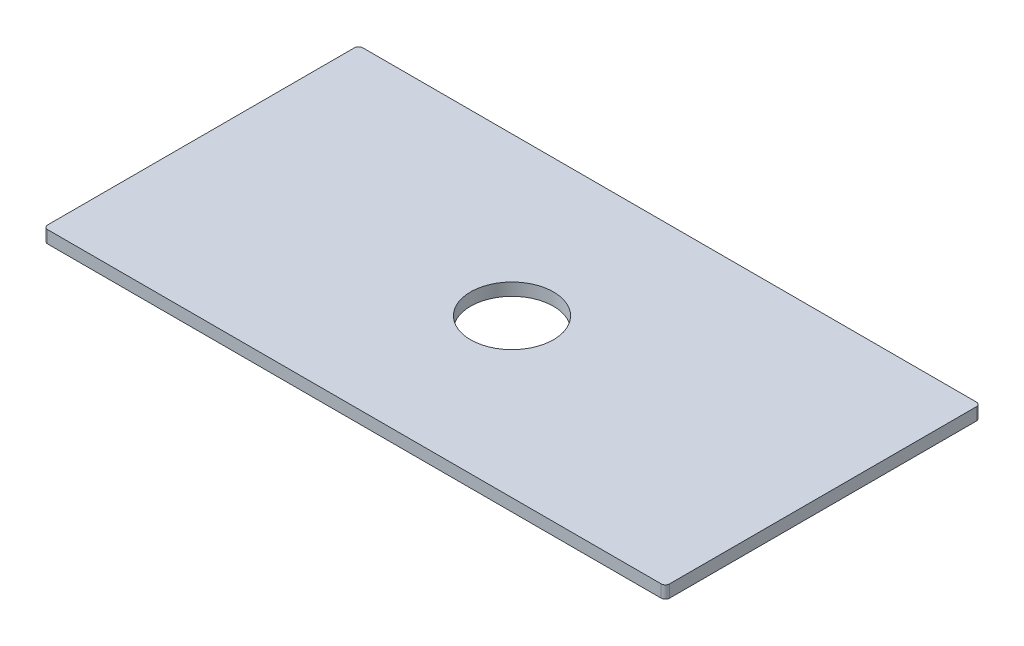
ISO-10303-21;
HEADER;
FILE_DESCRIPTION(('STEP AP214'),'2;1');
FILE_NAME('part.step','',(''),(''),'','','');
FILE_SCHEMA(('AUTOMOTIVE_DESIGN { 1 0 10303 214 1 1 1 1 }'));
ENDSEC;
DATA;
#1=APPLICATION_CONTEXT('core data for automotive mechanical design processes');
#2=APPLICATION_PROTOCOL_DEFINITION('international standard','automotive_design',2000,#1);
#3=PRODUCT_CONTEXT('',#1,'mechanical');
#4=PRODUCT('Part','Part','',(#3));
#5=PRODUCT_RELATED_PRODUCT_CATEGORY('part','',(#4));
#6=PRODUCT_DEFINITION_FORMATION('','',#4);
#7=PRODUCT_DEFINITION_CONTEXT('part definition',#1,'design');
#8=PRODUCT_DEFINITION('design','',#6,#7);
#9=PRODUCT_DEFINITION_SHAPE('','',#8);
#10=(LENGTH_UNIT() NAMED_UNIT(*) SI_UNIT(.MILLI.,.METRE.));
#11=(NAMED_UNIT(*) PLANE_ANGLE_UNIT() SI_UNIT($,.RADIAN.));
#12=(NAMED_UNIT(*) SI_UNIT($,.STERADIAN.) SOLID_ANGLE_UNIT());
#13=UNCERTAINTY_MEASURE_WITH_UNIT(LENGTH_MEASURE(1.E-05),#10,'distance_accuracy_value','');
#14=(GEOMETRIC_REPRESENTATION_CONTEXT(3) GLOBAL_UNCERTAINTY_ASSIGNED_CONTEXT((#13)) GLOBAL_UNIT_ASSIGNED_CONTEXT((#10,
#11,#12)) REPRESENTATION_CONTEXT('',''));
#15=CARTESIAN_POINT('',(0.,0.,0.));
#16=DIRECTION('',(0.,0.,1.));
#17=DIRECTION('',(1.,0.,0.));
#18=AXIS2_PLACEMENT_3D('',#15,#16,#17);
#19=CARTESIAN_POINT('',(75.,3.,-38.));
#20=DIRECTION('',(-1.,0.,0.));
#21=DIRECTION('',(0.,0.,1.));
#22=AXIS2_PLACEMENT_3D('',#19,#20,#21);
#23=PLANE('',#22);
#24=DIRECTION('',(0.,0.,-1.));
#25=VECTOR('',#24,1.);
#26=CARTESIAN_POINT('',(75.,0.,-38.));
#27=LINE('',#26,#25);
#28=CARTESIAN_POINT('',(75.,0.,37.));
#29=VERTEX_POINT('',#28);
#30=CARTESIAN_POINT('',(75.,0.,-37.));
#31=VERTEX_POINT('',#30);
#32=EDGE_CURVE('E133',#29,#31,#27,.T.);
#33=ORIENTED_EDGE('',*,*,#32,.T.);
#34=DIRECTION('',(0.,-1.,0.));
#35=VECTOR('',#34,1.);
#36=CARTESIAN_POINT('',(75.,3.,-37.));
#37=LINE('',#36,#35);
#38=CARTESIAN_POINT('',(75.,3.,-37.));
#39=VERTEX_POINT('',#38);
#40=EDGE_CURVE('E156',#31,#39,#37,.F.);
#41=ORIENTED_EDGE('',*,*,#40,.T.);
#42=DIRECTION('',(0.,0.,-1.));
#43=VECTOR('',#42,1.);
#44=CARTESIAN_POINT('',(75.,3.,-38.));
#45=LINE('',#44,#43);
#46=CARTESIAN_POINT('',(75.,3.,37.));
#47=VERTEX_POINT('',#46);
#48=EDGE_CURVE('E131',#47,#39,#45,.T.);
#49=ORIENTED_EDGE('',*,*,#48,.F.);
#50=DIRECTION('',(0.,-1.,0.));
#51=VECTOR('',#50,1.);
#52=CARTESIAN_POINT('',(75.,3.,37.));
#53=LINE('',#52,#51);
#54=EDGE_CURVE('E153',#47,#29,#53,.T.);
#55=ORIENTED_EDGE('',*,*,#54,.T.);
#56=EDGE_LOOP('',(#33,#41,#49,#55));
#57=FACE_BOUND('',#56,.T.);
#58=ADVANCED_FACE('F38',(#57),#23,.F.);
#59=CARTESIAN_POINT('',(-75.,3.,-38.));
#60=DIRECTION('',(0.,0.,1.));
#61=DIRECTION('',(1.,0.,0.));
#62=AXIS2_PLACEMENT_3D('',#59,#60,#61);
#63=PLANE('',#62);
#64=DIRECTION('',(-1.,0.,0.));
#65=VECTOR('',#64,1.);
#66=CARTESIAN_POINT('',(-75.,0.,-38.));
#67=LINE('',#66,#65);
#68=CARTESIAN_POINT('',(74.,0.,-38.));
#69=VERTEX_POINT('',#68);
#70=CARTESIAN_POINT('',(-74.,0.,-38.));
#71=VERTEX_POINT('',#70);
#72=EDGE_CURVE('E129',#69,#71,#67,.T.);
#73=ORIENTED_EDGE('',*,*,#72,.T.);
#74=DIRECTION('',(0.,-1.,0.));
#75=VECTOR('',#74,1.);
#76=CARTESIAN_POINT('',(-74.,3.,-38.));
#77=LINE('',#76,#75);
#78=CARTESIAN_POINT('',(-74.,3.,-38.));
#79=VERTEX_POINT('',#78);
#80=EDGE_CURVE('E108',#71,#79,#77,.F.);
#81=ORIENTED_EDGE('',*,*,#80,.T.);
#82=DIRECTION('',(-1.,0.,0.));
#83=VECTOR('',#82,1.);
#84=CARTESIAN_POINT('',(-75.,3.,-38.));
#85=LINE('',#84,#83);
#86=CARTESIAN_POINT('',(74.,3.,-38.));
#87=VERTEX_POINT('',#86);
#88=EDGE_CURVE('E172',#87,#79,#85,.T.);
#89=ORIENTED_EDGE('',*,*,#88,.F.);
#90=DIRECTION('',(0.,-1.,0.));
#91=VECTOR('',#90,1.);
#92=CARTESIAN_POINT('',(74.,3.,-38.));
#93=LINE('',#92,#91);
#94=EDGE_CURVE('E113',#87,#69,#93,.T.);
#95=ORIENTED_EDGE('',*,*,#94,.T.);
#96=EDGE_LOOP('',(#73,#81,#89,#95));
#97=FACE_BOUND('',#96,.T.);
#98=ADVANCED_FACE('F196',(#97),#63,.F.);
#99=CARTESIAN_POINT('',(-75.,3.,-38.));
#100=DIRECTION('',(1.,0.,0.));
#101=DIRECTION('',(0.,0.,-1.));
#102=AXIS2_PLACEMENT_3D('',#99,#100,#101);
#103=PLANE('',#102);
#104=DIRECTION('',(0.,0.,1.));
#105=VECTOR('',#104,1.);
#106=CARTESIAN_POINT('',(-75.,3.,-38.));
#107=LINE('',#106,#105);
#108=CARTESIAN_POINT('',(-75.,3.,-37.));
#109=VERTEX_POINT('',#108);
#110=CARTESIAN_POINT('',(-75.,3.,37.));
#111=VERTEX_POINT('',#110);
#112=EDGE_CURVE('E122',#109,#111,#107,.T.);
#113=ORIENTED_EDGE('',*,*,#112,.F.);
#114=DIRECTION('',(0.,-1.,0.));
#115=VECTOR('',#114,1.);
#116=CARTESIAN_POINT('',(-75.,3.,-37.));
#117=LINE('',#116,#115);
#118=CARTESIAN_POINT('',(-75.,0.,-37.));
#119=VERTEX_POINT('',#118);
#120=EDGE_CURVE('E107',#109,#119,#117,.T.);
#121=ORIENTED_EDGE('',*,*,#120,.T.);
#122=DIRECTION('',(0.,0.,1.));
#123=VECTOR('',#122,1.);
#124=CARTESIAN_POINT('',(-75.,0.,-38.));
#125=LINE('',#124,#123);
#126=CARTESIAN_POINT('',(-75.,0.,37.));
#127=VERTEX_POINT('',#126);
#128=EDGE_CURVE('E120',#119,#127,#125,.T.);
#129=ORIENTED_EDGE('',*,*,#128,.T.);
#130=DIRECTION('',(0.,-1.,0.));
#131=VECTOR('',#130,1.);
#132=CARTESIAN_POINT('',(-75.,3.,37.));
#133=LINE('',#132,#131);
#134=EDGE_CURVE('E124',#127,#111,#133,.F.);
#135=ORIENTED_EDGE('',*,*,#134,.T.);
#136=EDGE_LOOP('',(#113,#121,#129,#135));
#137=FACE_BOUND('',#136,.T.);
#138=ADVANCED_FACE('F119',(#137),#103,.F.);
#139=CARTESIAN_POINT('',(-75.,3.,38.));
#140=DIRECTION('',(0.,0.,-1.));
#141=DIRECTION('',(-1.,0.,0.));
#142=AXIS2_PLACEMENT_3D('',#139,#140,#141);
#143=PLANE('',#142);
#144=DIRECTION('',(1.,0.,0.));
#145=VECTOR('',#144,1.);
#146=CARTESIAN_POINT('',(-75.,0.,38.));
#147=LINE('',#146,#145);
#148=CARTESIAN_POINT('',(-74.,0.,38.));
#149=VERTEX_POINT('',#148);
#150=CARTESIAN_POINT('',(74.,0.,38.));
#151=VERTEX_POINT('',#150);
#152=EDGE_CURVE('E128',#149,#151,#147,.T.);
#153=ORIENTED_EDGE('',*,*,#152,.T.);
#154=DIRECTION('',(0.,-1.,0.));
#155=VECTOR('',#154,1.);
#156=CARTESIAN_POINT('',(74.,3.,38.));
#157=LINE('',#156,#155);
#158=CARTESIAN_POINT('',(74.,3.,38.));
#159=VERTEX_POINT('',#158);
#160=EDGE_CURVE('E11',#151,#159,#157,.F.);
#161=ORIENTED_EDGE('',*,*,#160,.T.);
#162=DIRECTION('',(1.,0.,0.));
#163=VECTOR('',#162,1.);
#164=CARTESIAN_POINT('',(-75.,3.,38.));
#165=LINE('',#164,#163);
#166=CARTESIAN_POINT('',(-74.,3.,38.));
#167=VERTEX_POINT('',#166);
#168=EDGE_CURVE('E137',#167,#159,#165,.T.);
#169=ORIENTED_EDGE('',*,*,#168,.F.);
#170=DIRECTION('',(0.,-1.,0.));
#171=VECTOR('',#170,1.);
#172=CARTESIAN_POINT('',(-74.,3.,38.));
#173=LINE('',#172,#171);
#174=EDGE_CURVE('E46',#167,#149,#173,.T.);
#175=ORIENTED_EDGE('',*,*,#174,.T.);
#176=EDGE_LOOP('',(#153,#161,#169,#175));
#177=FACE_BOUND('',#176,.T.);
#178=ADVANCED_FACE('F159',(#177),#143,.F.);
#179=CARTESIAN_POINT('',(0.,3.,0.));
#180=DIRECTION('',(0.,1.,0.));
#181=DIRECTION('',(0.,0.,1.));
#182=AXIS2_PLACEMENT_3D('',#179,#180,#181);
#183=PLANE('',#182);
#184=CARTESIAN_POINT('',(0.,3.,0.));
#185=DIRECTION('',(0.,1.,0.));
#186=DIRECTION('',(0.,0.,1.));
#187=AXIS2_PLACEMENT_3D('',#184,#185,#186);
#188=CIRCLE('',#187,10.);
#189=CARTESIAN_POINT('',(0.,3.,10.));
#190=VERTEX_POINT('',#189);
#191=EDGE_CURVE('E177',#190,#190,#188,.T.);
#192=ORIENTED_EDGE('',*,*,#191,.F.);
#193=EDGE_LOOP('',(#192));
#194=FACE_BOUND('',#193,.T.);
#195=ORIENTED_EDGE('',*,*,#88,.T.);
#196=CARTESIAN_POINT('',(-74.,3.,-37.));
#197=DIRECTION('',(0.,1.,0.));
#198=DIRECTION('',(0.,0.,1.));
#199=AXIS2_PLACEMENT_3D('',#196,#197,#198);
#200=CIRCLE('',#199,1.);
#201=EDGE_CURVE('E151',#79,#109,#200,.T.);
#202=ORIENTED_EDGE('',*,*,#201,.T.);
#203=ORIENTED_EDGE('',*,*,#112,.T.);
#204=CARTESIAN_POINT('',(-74.,3.,37.));
#205=DIRECTION('',(0.,1.,0.));
#206=DIRECTION('',(0.,0.,1.));
#207=AXIS2_PLACEMENT_3D('',#204,#205,#206);
#208=CIRCLE('',#207,1.);
#209=EDGE_CURVE('E58',#111,#167,#208,.T.);
#210=ORIENTED_EDGE('',*,*,#209,.T.);
#211=ORIENTED_EDGE('',*,*,#168,.T.);
#212=CARTESIAN_POINT('',(74.,3.,37.));
#213=DIRECTION('',(0.,1.,0.));
#214=DIRECTION('',(0.,0.,1.));
#215=AXIS2_PLACEMENT_3D('',#212,#213,#214);
#216=CIRCLE('',#215,1.);
#217=EDGE_CURVE('E147',#159,#47,#216,.T.);
#218=ORIENTED_EDGE('',*,*,#217,.T.);
#219=ORIENTED_EDGE('',*,*,#48,.T.);
#220=CARTESIAN_POINT('',(74.,3.,-37.));
#221=DIRECTION('',(0.,1.,0.));
#222=DIRECTION('',(0.,0.,1.));
#223=AXIS2_PLACEMENT_3D('',#220,#221,#222);
#224=CIRCLE('',#223,1.);
#225=EDGE_CURVE('E149',#39,#87,#224,.T.);
#226=ORIENTED_EDGE('',*,*,#225,.T.);
#227=EDGE_LOOP('',(#195,#202,#203,#210,#211,#218,#219,#226));
#228=FACE_BOUND('',#227,.T.);
#229=ADVANCED_FACE('F190',(#194,#228),#183,.T.);
#230=CARTESIAN_POINT('',(0.,0.,0.));
#231=DIRECTION('',(0.,1.,0.));
#232=DIRECTION('',(0.,0.,1.));
#233=AXIS2_PLACEMENT_3D('',#230,#231,#232);
#234=PLANE('',#233);
#235=CARTESIAN_POINT('',(0.,0.,0.));
#236=DIRECTION('',(0.,1.,0.));
#237=DIRECTION('',(0.,0.,1.));
#238=AXIS2_PLACEMENT_3D('',#235,#236,#237);
#239=CIRCLE('',#238,10.);
#240=CARTESIAN_POINT('',(0.,0.,10.));
#241=VERTEX_POINT('',#240);
#242=EDGE_CURVE('E181',#241,#241,#239,.T.);
#243=ORIENTED_EDGE('',*,*,#242,.T.);
#244=EDGE_LOOP('',(#243));
#245=FACE_BOUND('',#244,.T.);
#246=ORIENTED_EDGE('',*,*,#128,.F.);
#247=CARTESIAN_POINT('',(-74.,0.,-37.));
#248=DIRECTION('',(0.,1.,0.));
#249=DIRECTION('',(0.,0.,1.));
#250=AXIS2_PLACEMENT_3D('',#247,#248,#249);
#251=CIRCLE('',#250,1.);
#252=EDGE_CURVE('E103',#119,#71,#251,.F.);
#253=ORIENTED_EDGE('',*,*,#252,.T.);
#254=ORIENTED_EDGE('',*,*,#72,.F.);
#255=CARTESIAN_POINT('',(74.,0.,-37.));
#256=DIRECTION('',(0.,1.,0.));
#257=DIRECTION('',(0.,0.,1.));
#258=AXIS2_PLACEMENT_3D('',#255,#256,#257);
#259=CIRCLE('',#258,1.);
#260=EDGE_CURVE('E114',#69,#31,#259,.F.);
#261=ORIENTED_EDGE('',*,*,#260,.T.);
#262=ORIENTED_EDGE('',*,*,#32,.F.);
#263=CARTESIAN_POINT('',(74.,0.,37.));
#264=DIRECTION('',(0.,1.,0.));
#265=DIRECTION('',(0.,0.,1.));
#266=AXIS2_PLACEMENT_3D('',#263,#264,#265);
#267=CIRCLE('',#266,1.);
#268=EDGE_CURVE('E140',#29,#151,#267,.F.);
#269=ORIENTED_EDGE('',*,*,#268,.T.);
#270=ORIENTED_EDGE('',*,*,#152,.F.);
#271=CARTESIAN_POINT('',(-74.,0.,37.));
#272=DIRECTION('',(0.,1.,0.));
#273=DIRECTION('',(0.,0.,1.));
#274=AXIS2_PLACEMENT_3D('',#271,#272,#273);
#275=CIRCLE('',#274,1.);
#276=EDGE_CURVE('E123',#149,#127,#275,.F.);
#277=ORIENTED_EDGE('',*,*,#276,.T.);
#278=EDGE_LOOP('',(#246,#253,#254,#261,#262,#269,#270,#277));
#279=FACE_BOUND('',#278,.T.);
#280=ADVANCED_FACE('F126',(#245,#279),#234,.F.);
#281=CARTESIAN_POINT('',(-74.,3.,-37.));
#282=DIRECTION('',(0.,-1.,0.));
#283=DIRECTION('',(0.,0.,-1.));
#284=AXIS2_PLACEMENT_3D('',#281,#282,#283);
#285=CYLINDRICAL_SURFACE('',#284,1.);
#286=ORIENTED_EDGE('',*,*,#201,.F.);
#287=ORIENTED_EDGE('',*,*,#80,.F.);
#288=ORIENTED_EDGE('',*,*,#252,.F.);
#289=ORIENTED_EDGE('',*,*,#120,.F.);
#290=EDGE_LOOP('',(#286,#287,#288,#289));
#291=FACE_BOUND('',#290,.T.);
#292=ADVANCED_FACE('F106',(#291),#285,.T.);
#293=CARTESIAN_POINT('',(74.,3.,-37.));
#294=DIRECTION('',(0.,-1.,0.));
#295=DIRECTION('',(0.,0.,-1.));
#296=AXIS2_PLACEMENT_3D('',#293,#294,#295);
#297=CYLINDRICAL_SURFACE('',#296,1.);
#298=ORIENTED_EDGE('',*,*,#225,.F.);
#299=ORIENTED_EDGE('',*,*,#40,.F.);
#300=ORIENTED_EDGE('',*,*,#260,.F.);
#301=ORIENTED_EDGE('',*,*,#94,.F.);
#302=EDGE_LOOP('',(#298,#299,#300,#301));
#303=FACE_BOUND('',#302,.T.);
#304=ADVANCED_FACE('F198',(#303),#297,.T.);
#305=CARTESIAN_POINT('',(74.,3.,37.));
#306=DIRECTION('',(0.,-1.,0.));
#307=DIRECTION('',(0.,0.,-1.));
#308=AXIS2_PLACEMENT_3D('',#305,#306,#307);
#309=CYLINDRICAL_SURFACE('',#308,1.);
#310=ORIENTED_EDGE('',*,*,#217,.F.);
#311=ORIENTED_EDGE('',*,*,#160,.F.);
#312=ORIENTED_EDGE('',*,*,#268,.F.);
#313=ORIENTED_EDGE('',*,*,#54,.F.);
#314=EDGE_LOOP('',(#310,#311,#312,#313));
#315=FACE_BOUND('',#314,.T.);
#316=ADVANCED_FACE('F166',(#315),#309,.T.);
#317=CARTESIAN_POINT('',(-74.,3.,37.));
#318=DIRECTION('',(0.,-1.,0.));
#319=DIRECTION('',(0.,0.,-1.));
#320=AXIS2_PLACEMENT_3D('',#317,#318,#319);
#321=CYLINDRICAL_SURFACE('',#320,1.);
#322=ORIENTED_EDGE('',*,*,#209,.F.);
#323=ORIENTED_EDGE('',*,*,#134,.F.);
#324=ORIENTED_EDGE('',*,*,#276,.F.);
#325=ORIENTED_EDGE('',*,*,#174,.F.);
#326=EDGE_LOOP('',(#322,#323,#324,#325));
#327=FACE_BOUND('',#326,.T.);
#328=ADVANCED_FACE('F40',(#327),#321,.T.);
#329=CARTESIAN_POINT('',(0.,0.,0.));
#330=DIRECTION('',(0.,1.,0.));
#331=DIRECTION('',(0.,0.,1.));
#332=AXIS2_PLACEMENT_3D('',#329,#330,#331);
#333=CYLINDRICAL_SURFACE('',#332,10.);
#334=ORIENTED_EDGE('',*,*,#242,.F.);
#335=EDGE_LOOP('',(#334));
#336=FACE_BOUND('',#335,.T.);
#337=ORIENTED_EDGE('',*,*,#191,.T.);
#338=EDGE_LOOP('',(#337));
#339=FACE_BOUND('',#338,.T.);
#340=ADVANCED_FACE('F188',(#336,#339),#333,.F.);
#341=CLOSED_SHELL('',(#58,#98,#138,#178,#229,#280,#292,#304,#316,#328,#340));
#342=MANIFOLD_SOLID_BREP('B2',#341);
#343=ADVANCED_BREP_SHAPE_REPRESENTATION('',(#18,#342),#14);
#344=SHAPE_DEFINITION_REPRESENTATION(#9,#343);
ENDSEC;
END-ISO-10303-21;
